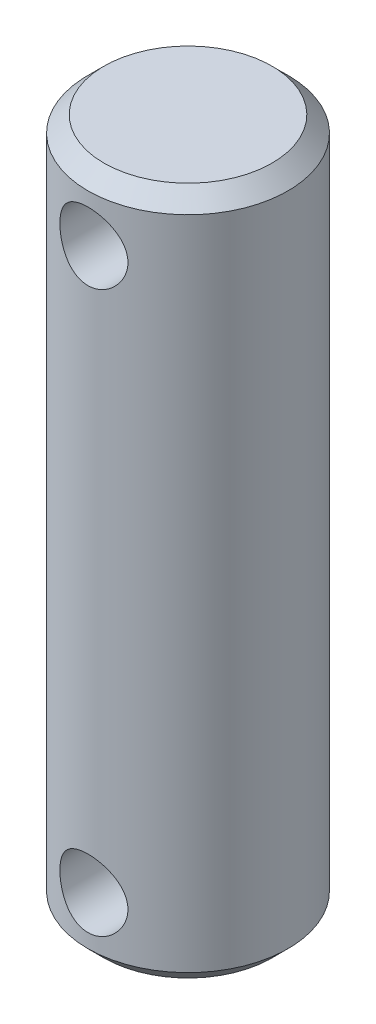
ISO-10303-21;
HEADER;
FILE_DESCRIPTION(('STEP AP214'),'2;1');
FILE_NAME('part.step','',(''),(''),'','','');
FILE_SCHEMA(('AUTOMOTIVE_DESIGN { 1 0 10303 214 1 1 1 1 }'));
ENDSEC;
DATA;
#1=APPLICATION_CONTEXT('core data for automotive mechanical design processes');
#2=APPLICATION_PROTOCOL_DEFINITION('international standard','automotive_design',2000,#1);
#3=PRODUCT_CONTEXT('',#1,'mechanical');
#4=PRODUCT('Part','Part','',(#3));
#5=PRODUCT_RELATED_PRODUCT_CATEGORY('part','',(#4));
#6=PRODUCT_DEFINITION_FORMATION('','',#4);
#7=PRODUCT_DEFINITION_CONTEXT('part definition',#1,'design');
#8=PRODUCT_DEFINITION('design','',#6,#7);
#9=PRODUCT_DEFINITION_SHAPE('','',#8);
#10=(LENGTH_UNIT() NAMED_UNIT(*) SI_UNIT(.MILLI.,.METRE.));
#11=(NAMED_UNIT(*) PLANE_ANGLE_UNIT() SI_UNIT($,.RADIAN.));
#12=(NAMED_UNIT(*) SI_UNIT($,.STERADIAN.) SOLID_ANGLE_UNIT());
#13=UNCERTAINTY_MEASURE_WITH_UNIT(LENGTH_MEASURE(1.E-05),#10,'distance_accuracy_value','');
#14=(GEOMETRIC_REPRESENTATION_CONTEXT(3) GLOBAL_UNCERTAINTY_ASSIGNED_CONTEXT((#13)) GLOBAL_UNIT_ASSIGNED_CONTEXT((#10,
#11,#12)) REPRESENTATION_CONTEXT('',''));
#15=CARTESIAN_POINT('',(0.,0.,0.));
#16=DIRECTION('',(0.,0.,1.));
#17=DIRECTION('',(1.,0.,0.));
#18=AXIS2_PLACEMENT_3D('',#15,#16,#17);
#19=CARTESIAN_POINT('',(0.,43.,0.));
#20=DIRECTION('',(0.,-1.,0.));
#21=DIRECTION('',(0.,0.,-1.));
#22=AXIS2_PLACEMENT_3D('',#19,#20,#21);
#23=CYLINDRICAL_SURFACE('',#22,12.5);
#24=CARTESIAN_POINT('',(0.,39.25,-12.5));
#25=CARTESIAN_POINT('',(-0.231629316585797,39.2500020330341,-12.5000013493631));
#26=CARTESIAN_POINT('',(-0.463244602260156,39.2310026670462,-12.493502868787));
#27=CARTESIAN_POINT('',(-0.919637198733393,39.1557510509299,-12.4682205879803));
#28=CARTESIAN_POINT('',(-1.14441406994913,39.0994964112488,-12.4494359997198));
#29=CARTESIAN_POINT('',(-1.58048439723264,38.9518965380055,-12.4016188733298));
#30=CARTESIAN_POINT('',(-1.79180021823001,38.860611378287,-12.3726038861914));
#31=CARTESIAN_POINT('',(-2.1961203899874,38.6458184811844,-12.3072763657775));
#32=CARTESIAN_POINT('',(-2.38912089291743,38.5223039931499,-12.270962304028));
#33=CARTESIAN_POINT('',(-2.75825261944734,38.2419106918981,-12.1933910285169));
#34=CARTESIAN_POINT('',(-2.93363688121842,38.0840824421219,-12.1520119725704));
#35=CARTESIAN_POINT('',(-3.25602333800846,37.7415597009182,-12.069633438027));
#36=CARTESIAN_POINT('',(-3.40301894005994,37.5568589860642,-12.0286340497037));
#37=CARTESIAN_POINT('',(-3.66879190776174,37.1590227206061,-11.9503048632061));
#38=CARTESIAN_POINT('',(-3.78658554363524,36.9451980705236,-11.9131228611846));
#39=CARTESIAN_POINT('',(-3.98421855180598,36.499305339374,-11.8484975327096));
#40=CARTESIAN_POINT('',(-4.06407004270031,36.2672431109649,-11.8210510974587));
#41=CARTESIAN_POINT('',(-4.180727158555,35.7999754672721,-11.7802904138908));
#42=CARTESIAN_POINT('',(-4.21893677153849,35.5651618601511,-11.7665167255043));
#43=CARTESIAN_POINT('',(-4.2556150496915,35.0920834933359,-11.7533040945085));
#44=CARTESIAN_POINT('',(-4.25409658909983,34.8538198766629,-11.7538605081001));
#45=CARTESIAN_POINT('',(-4.21244934024964,34.3927050541706,-11.7688435667819));
#46=CARTESIAN_POINT('',(-4.1741694203804,34.1696614961546,-11.7826060062583));
#47=CARTESIAN_POINT('',(-4.06310816523945,33.733374512476,-11.8213609901718));
#48=CARTESIAN_POINT('',(-3.99032254229152,33.5201323083421,-11.8463549302143));
#49=CARTESIAN_POINT('',(-3.81113653039608,33.1053676287839,-11.9052184288415));
#50=CARTESIAN_POINT('',(-3.70419900732797,32.9040979714414,-11.9392282253861));
#51=CARTESIAN_POINT('',(-3.46011773998614,32.5217829261275,-12.0122344758095));
#52=CARTESIAN_POINT('',(-3.3229649914025,32.3407435911989,-12.0512324147271));
#53=CARTESIAN_POINT('',(-3.01353124215082,31.993661489716,-12.1324166416207));
#54=CARTESIAN_POINT('',(-2.83974395035441,31.8289723564576,-12.1746609041245));
#55=CARTESIAN_POINT('',(-2.4665017699171,31.530714672255,-12.2557250188891));
#56=CARTESIAN_POINT('',(-2.26704421977735,31.397149352277,-12.294544515365));
#57=CARTESIAN_POINT('',(-1.84516436753422,31.1637817200249,-12.3649312356261));
#58=CARTESIAN_POINT('',(-1.62251944687187,31.0643554382244,-12.3964165316577));
#59=CARTESIAN_POINT('',(-1.16233553494295,30.9047926289126,-12.4479909440337));
#60=CARTESIAN_POINT('',(-0.924801969927407,30.8446418774178,-12.4680841857644));
#61=CARTESIAN_POINT('',(-0.453032806948612,30.7677666520223,-12.4939206883818));
#62=CARTESIAN_POINT('',(-0.219127772365227,30.7492140835185,-12.5002675966187));
#63=CARTESIAN_POINT('',(0.248508234272228,30.7508366933351,-12.499715139365));
#64=CARTESIAN_POINT('',(0.482239229767976,30.7710050341146,-12.4928181125577));
#65=CARTESIAN_POINT('',(0.935487055917019,30.8480582339634,-12.4669514589193));
#66=CARTESIAN_POINT('',(1.15521999196989,30.9038095457653,-12.4483547937561));
#67=CARTESIAN_POINT('',(1.58211571473706,31.049017457826,-12.4013331971436));
#68=CARTESIAN_POINT('',(1.78927688332144,31.138478386259,-12.3729070036624));
#69=CARTESIAN_POINT('',(2.19135854363443,31.3512234537794,-12.3081499547371));
#70=CARTESIAN_POINT('',(2.3858005114391,31.475351890635,-12.2716272117682));
#71=CARTESIAN_POINT('',(2.75168306551547,31.7529228847875,-12.1948041286534));
#72=CARTESIAN_POINT('',(2.9231163500378,31.9063747105205,-12.1545025961777));
#73=CARTESIAN_POINT('',(3.24657351287904,32.2468275664985,-12.0722386132383));
#74=CARTESIAN_POINT('',(3.39729328842665,32.435073487899,-12.0302879182072));
#75=CARTESIAN_POINT('',(3.66518020873975,32.8350778779993,-11.9514023496921));
#76=CARTESIAN_POINT('',(3.78234674334563,33.0468367741812,-11.914467567428));
#77=CARTESIAN_POINT('',(3.97933669538634,33.4881566802981,-11.8501336294714));
#78=CARTESIAN_POINT('',(4.05920753889126,33.717694646285,-11.8227223748613));
#79=CARTESIAN_POINT('',(4.17877629044749,34.1881175672848,-11.7809981443993));
#80=CARTESIAN_POINT('',(4.21849327320324,34.4289970776366,-11.7666789496003));
#81=CARTESIAN_POINT('',(4.2551029021973,34.9014252701727,-11.7534862510052));
#82=CARTESIAN_POINT('',(4.2541688433069,35.132785450644,-11.7538288765012));
#83=CARTESIAN_POINT('',(4.21488538095235,35.5918665676405,-11.7679720866019));
#84=CARTESIAN_POINT('',(4.17653837981658,35.8195877368765,-11.781771807111));
#85=CARTESIAN_POINT('',(4.06508169516974,36.2602486699102,-11.8206793925214));
#86=CARTESIAN_POINT('',(3.99270334550051,36.4733961386628,-11.8455487968498));
#87=CARTESIAN_POINT('',(3.81583792726955,36.8846811689962,-11.9036971533386));
#88=CARTESIAN_POINT('',(3.71134355482287,37.0828153034268,-11.9369780181425));
#89=CARTESIAN_POINT('',(3.46772073523882,37.4681337048613,-12.0100690469571));
#90=CARTESIAN_POINT('',(3.32724348872325,37.6544218744554,-12.0501058971147));
#91=CARTESIAN_POINT('',(3.01789256015419,38.0014819910172,-12.1312763731794));
#92=CARTESIAN_POINT('',(2.84901069833453,38.1622465618761,-12.1724103121393));
#93=CARTESIAN_POINT('',(2.4793015879225,38.4603796450803,-12.2531734329683));
#94=CARTESIAN_POINT('',(2.2774454476222,38.5965125530158,-12.2926709568964));
#95=CARTESIAN_POINT('',(1.85239769842136,38.8327805226005,-12.3638575017702));
#96=CARTESIAN_POINT('',(1.62921053671336,38.9329230670564,-12.3955481454238));
#97=CARTESIAN_POINT('',(1.1749855410373,39.0911995465962,-12.4466848305204));
#98=CARTESIAN_POINT('',(0.944413374480446,39.1505523489214,-12.4664836857426));
#99=CARTESIAN_POINT('',(0.475887689244039,39.2299455427374,-12.4931386057906));
#100=CARTESIAN_POINT('',(0.237936441911583,39.2499979116076,-12.4999986138946));
#101=CARTESIAN_POINT('',(0.,39.25,-12.5));
#102=B_SPLINE_CURVE_WITH_KNOTS('',3,(#24,#25,#26,#27,#28,#29,#30,#31,#32,#33,#34,#35,#36,#37,
#38,#39,#40,#41,#42,#43,#44,#45,#46,#47,#48,#49,#50,#51,#52,#53,#54,#55,#56,#57,#58,#59,#60,#61,
#62,#63,#64,#65,#66,#67,#68,#69,#70,#71,#72,#73,#74,#75,#76,#77,#78,#79,#80,#81,#82,#83,#84,#85,
#86,#87,#88,#89,#90,#91,#92,#93,#94,#95,#96,#97,#98,#99,#100,#101),.UNSPECIFIED.,.T.,.F.,(4,2,2,
2,2,2,2,2,2,2,2,2,2,2,2,2,2,2,2,2,2,2,2,2,2,2,2,2,2,2,2,2,2,2,2,2,2,2,4),(0.,0.694012031135522,
1.38806858050572,2.08094017307814,2.77395700894337,3.48937549744916,4.20495993509719,
4.94210626785764,5.67901699996315,6.39023024980915,7.10121302747361,7.77821403353031,
8.45529918574264,9.14360628251112,9.83211877686468,10.5581272082641,11.2842109731308,
12.0180534127162,12.7516299370932,13.4522781499046,14.1528026499667,14.8320547208526,
15.5113940346079,16.2089885679879,16.9068039604598,17.6376748123878,18.368558954226,
19.0985111385898,19.8281164030437,20.5187658396099,21.2093709316938,21.8857695188882,
22.5623220478608,23.2693695244284,23.976620961389,24.7129879656022,25.4492017820333,
26.1623287080454,26.8752382644273),.UNSPECIFIED.);
#103=CARTESIAN_POINT('',(0.,39.25,-12.5));
#104=VERTEX_POINT('',#103);
#105=EDGE_CURVE('E50',#104,#104,#102,.T.);
#106=ORIENTED_EDGE('',*,*,#105,.T.);
#107=EDGE_LOOP('',(#106));
#108=FACE_BOUND('',#107,.T.);
#109=CARTESIAN_POINT('',(4.25,35.,11.7553179455087));
#110=CARTESIAN_POINT('',(4.25000208635938,34.7688082243958,11.7553163048564));
#111=CARTESIAN_POINT('',(4.23107177309128,34.5376306111017,11.7622127031611));
#112=CARTESIAN_POINT('',(4.15611937649357,34.0821430943685,11.7889024426549));
#113=CARTESIAN_POINT('',(4.10009241001671,33.8578340991343,11.8086974817267));
#114=CARTESIAN_POINT('',(3.95315727615972,33.4227597886088,11.8586887228588));
#115=CARTESIAN_POINT('',(3.86231972243053,33.2119680573483,11.8888638561852));
#116=CARTESIAN_POINT('',(3.64858465717113,32.8085451145788,11.9561841704273));
#117=CARTESIAN_POINT('',(3.52567963418154,32.6159181723876,11.9933309838111));
#118=CARTESIAN_POINT('',(3.24593667986677,32.2464478386544,12.0721055733369));
#119=CARTESIAN_POINT('',(3.08801191357713,32.0704516300864,12.1138482614208));
#120=CARTESIAN_POINT('',(2.74502977872382,31.7468608782459,12.1961419607755));
#121=CARTESIAN_POINT('',(2.55996786105974,31.5992711064602,12.2366927708767));
#122=CARTESIAN_POINT('',(2.16173358215593,31.332803063851,12.3133695834904));
#123=CARTESIAN_POINT('',(1.9479322684075,31.2148175164114,12.3493447648353));
#124=CARTESIAN_POINT('',(1.50208314069309,31.0168239888865,12.4114588114545));
#125=CARTESIAN_POINT('',(1.27004047751297,30.9368053327207,12.4376004414402));
#126=CARTESIAN_POINT('',(0.803181808925197,30.819904815012,12.4762877361144));
#127=CARTESIAN_POINT('',(0.56876802409283,30.781570565411,12.4892899687544));
#128=CARTESIAN_POINT('',(0.0964986813327523,30.7445035304582,12.5018568685094));
#129=CARTESIAN_POINT('',(-0.141355937364765,30.7457601346843,12.5014251359524));
#130=CARTESIAN_POINT('',(-0.603455244429959,30.7869293778599,12.4874792686763));
#131=CARTESIAN_POINT('',(-0.827859366125014,30.8252633639397,12.474499409838));
#132=CARTESIAN_POINT('',(-1.26683563867679,30.9368817672938,12.4375910854643));
#133=CARTESIAN_POINT('',(-1.48140711554011,31.0101685765457,12.4136618706201));
#134=CARTESIAN_POINT('',(-1.8980164033555,31.1905041300386,12.3568751775078));
#135=CARTESIAN_POINT('',(-2.09984758406958,31.2979923868106,12.3239022889639));
#136=CARTESIAN_POINT('',(-2.48306659203639,31.5433137607319,12.2524460502634));
#137=CARTESIAN_POINT('',(-2.66444855405648,31.681155550554,12.2139611262977));
#138=CARTESIAN_POINT('',(-3.01099992399037,31.9911745301492,12.1333048225972));
#139=CARTESIAN_POINT('',(-3.17494418986543,32.1647002678062,12.0910451976412));
#140=CARTESIAN_POINT('',(-3.4718123267595,32.5371276123441,12.0091752957356));
#141=CARTESIAN_POINT('',(-3.60473100646118,32.7360334573203,11.969565462949));
#142=CARTESIAN_POINT('',(-3.83756473071074,33.1575999287105,11.8969851778806));
#143=CARTESIAN_POINT('',(-3.93694148373781,33.3805784989992,11.8641260508176));
#144=CARTESIAN_POINT('',(-4.09631339640205,33.841505720852,11.8100543141711));
#145=CARTESIAN_POINT('',(-4.15632586418345,34.0794477426114,11.7888365866345));
#146=CARTESIAN_POINT('',(-4.23272709729825,34.551640096284,11.7616154920121));
#147=CARTESIAN_POINT('',(-4.25102291540232,34.7855435602831,11.7549476419358));
#148=CARTESIAN_POINT('',(-4.24888913268011,35.253124045222,11.7557200468072));
#149=CARTESIAN_POINT('',(-4.22846693505826,35.4868011009053,11.7631576046845));
#150=CARTESIAN_POINT('',(-4.15119312232908,35.9384588804628,11.790638359865));
#151=CARTESIAN_POINT('',(-4.09568855042672,36.1567015418879,11.8102149538794));
#152=CARTESIAN_POINT('',(-3.9514537893724,36.5807242875293,11.8592485003546));
#153=CARTESIAN_POINT('',(-3.86271756175014,36.7865020988783,11.888707248384));
#154=CARTESIAN_POINT('',(-3.65124748009679,37.1872093806727,11.9553766913527));
#155=CARTESIAN_POINT('',(-3.52749746510955,37.3815646574045,11.9928092351957));
#156=CARTESIAN_POINT('',(-3.25065304738288,37.7474387202912,12.0707872460142));
#157=CARTESIAN_POINT('',(-3.09754966045709,37.9189504874256,12.1113336637695));
#158=CARTESIAN_POINT('',(-2.75718975144257,38.2432047947156,12.1934414759765));
#159=CARTESIAN_POINT('',(-2.56860120561712,38.3945664440502,12.2349510943746));
#160=CARTESIAN_POINT('',(-2.16767839127811,38.6635958933644,12.3123024299383));
#161=CARTESIAN_POINT('',(-1.9553448608948,38.7812647403048,12.3481443232058));
#162=CARTESIAN_POINT('',(-1.51390748124952,38.9785220351902,12.4099713333259));
#163=CARTESIAN_POINT('',(-1.28491760269165,39.0583455126643,12.4360170721838));
#164=CARTESIAN_POINT('',(-0.815699002397316,39.1780013666957,12.4755748071516));
#165=CARTESIAN_POINT('',(-0.575474556193982,39.2178488293486,12.489091531298));
#166=CARTESIAN_POINT('',(-0.103211830111088,39.2550209742181,12.50169717107));
#167=CARTESIAN_POINT('',(0.128654421017075,39.2543244388139,12.501457487594));
#168=CARTESIAN_POINT('',(0.588812496753036,39.2153415064129,12.4882452162174));
#169=CARTESIAN_POINT('',(0.817104629585829,39.177058369155,12.4752737324961));
#170=CARTESIAN_POINT('',(1.25973733436524,39.0653164091026,12.438311718123));
#171=CARTESIAN_POINT('',(1.47424962273104,38.992469689247,12.4145132190251));
#172=CARTESIAN_POINT('',(1.88808156366101,38.8142408217572,12.3583495347409));
#173=CARTESIAN_POINT('',(2.08739842506849,38.7088527146591,12.3259827805629));
#174=CARTESIAN_POINT('',(2.47341490547125,38.4639468867196,12.2544776933187));
#175=CARTESIAN_POINT('',(2.65935109194141,38.3232880355071,12.2151293747917));
#176=CARTESIAN_POINT('',(3.0056225058322,38.0137518219909,12.1345744052391));
#177=CARTESIAN_POINT('',(3.16594936631593,37.8448652740194,12.0933671524889));
#178=CARTESIAN_POINT('',(3.46317770167238,37.4753569274188,12.0117094140378));
#179=CARTESIAN_POINT('',(3.59884229876753,37.2737145025818,11.9713600094017));
#180=CARTESIAN_POINT('',(3.83428262236864,36.8492278836957,11.8980483180312));
#181=CARTESIAN_POINT('',(3.93406590564969,36.6263881664128,11.865084476414));
#182=CARTESIAN_POINT('',(4.09175788445509,36.1729356054837,11.8116162303556));
#183=CARTESIAN_POINT('',(4.15089676108841,35.9427949668864,11.7907491035731));
#184=CARTESIAN_POINT('',(4.23000923378121,35.4750959809143,11.7626034107323));
#185=CARTESIAN_POINT('',(4.24999785634726,35.2375405150521,11.7553196312149));
#186=CARTESIAN_POINT('',(4.25,35.,11.7553179455087));
#187=B_SPLINE_CURVE_WITH_KNOTS('',3,(#109,#110,#111,#112,#113,#114,#115,#116,#117,#118,#119,
#120,#121,#122,#123,#124,#125,#126,#127,#128,#129,#130,#131,#132,#133,#134,#135,#136,#137,#138,
#139,#140,#141,#142,#143,#144,#145,#146,#147,#148,#149,#150,#151,#152,#153,#154,#155,#156,#157,
#158,#159,#160,#161,#162,#163,#164,#165,#166,#167,#168,#169,#170,#171,#172,#173,#174,#175,#176,
#177,#178,#179,#180,#181,#182,#183,#184,#185,#186),.UNSPECIFIED.,.T.,.F.,(4,2,2,2,2,2,2,2,2,2,2,
2,2,2,2,2,2,2,2,2,2,2,2,2,2,2,2,2,2,2,2,2,2,2,2,2,2,2,4),(0.,0.692694920384615,1.38548104047712,
2.07686921235575,2.76841948009047,3.48554525708903,4.20279138623515,4.93959691860359,
5.67619514235265,6.38621339082408,7.09604135470939,7.77691942027095,8.45784408804076,
9.14789875658826,9.83815084536889,10.5621283168264,11.2862268402086,12.0214474433795,
12.7563445591683,13.456908323454,14.1573381476704,14.8323840278356,15.5075526290563,
16.2047830406201,16.9022271951569,17.6348081128836,18.3673662641226,19.0953134364972,
19.8229857936747,20.515174766614,21.2073037140138,21.8876085563469,22.5680380602091,
23.2742297793021,23.9806517515895,24.7161707244757,25.4515347027242,26.1635249917672,
26.8752419537226),.UNSPECIFIED.);
#188=CARTESIAN_POINT('',(4.25,35.,11.7553179455087));
#189=VERTEX_POINT('',#188);
#190=EDGE_CURVE('E113',#189,#189,#187,.T.);
#191=ORIENTED_EDGE('',*,*,#190,.T.);
#192=EDGE_LOOP('',(#191));
#193=FACE_BOUND('',#192,.T.);
#194=CARTESIAN_POINT('',(0.,-30.75,-12.5));
#195=CARTESIAN_POINT('',(-0.231629316585798,-30.7499979669659,-12.5000013493631));
#196=CARTESIAN_POINT('',(-0.463244602260157,-30.7689973329538,-12.493502868787));
#197=CARTESIAN_POINT('',(-0.919637198733394,-30.8442489490701,-12.4682205879803));
#198=CARTESIAN_POINT('',(-1.14441406994913,-30.9005035887512,-12.4494359997198));
#199=CARTESIAN_POINT('',(-1.58048439723264,-31.0481034619945,-12.4016188733298));
#200=CARTESIAN_POINT('',(-1.79180021823001,-31.139388621713,-12.3726038861914));
#201=CARTESIAN_POINT('',(-2.1961203899874,-31.3541815188156,-12.3072763657775));
#202=CARTESIAN_POINT('',(-2.38912089291743,-31.4776960068501,-12.270962304028));
#203=CARTESIAN_POINT('',(-2.75825261944734,-31.7580893081019,-12.1933910285169));
#204=CARTESIAN_POINT('',(-2.93363688121843,-31.9159175578781,-12.1520119725704));
#205=CARTESIAN_POINT('',(-3.25602333800847,-32.2584402990818,-12.069633438027));
#206=CARTESIAN_POINT('',(-3.40301894005995,-32.4431410139358,-12.0286340497037));
#207=CARTESIAN_POINT('',(-3.66879190776175,-32.8409772793939,-11.9503048632061));
#208=CARTESIAN_POINT('',(-3.78658554363525,-33.0548019294764,-11.9131228611846));
#209=CARTESIAN_POINT('',(-3.98421855180598,-33.500694660626,-11.8484975327096));
#210=CARTESIAN_POINT('',(-4.06407004270031,-33.7327568890351,-11.8210510974587));
#211=CARTESIAN_POINT('',(-4.180727158555,-34.2000245327279,-11.7802904138908));
#212=CARTESIAN_POINT('',(-4.21893677153849,-34.4348381398489,-11.7665167255043));
#213=CARTESIAN_POINT('',(-4.2556150496915,-34.9079165066641,-11.7533040945085));
#214=CARTESIAN_POINT('',(-4.25409658909983,-35.1461801233371,-11.7538605081001));
#215=CARTESIAN_POINT('',(-4.21244934024964,-35.6072949458294,-11.7688435667819));
#216=CARTESIAN_POINT('',(-4.1741694203804,-35.8303385038454,-11.7826060062583));
#217=CARTESIAN_POINT('',(-4.06310816523945,-36.266625487524,-11.8213609901718));
#218=CARTESIAN_POINT('',(-3.99032254229152,-36.4798676916579,-11.8463549302143));
#219=CARTESIAN_POINT('',(-3.81113653039608,-36.8946323712161,-11.9052184288415));
#220=CARTESIAN_POINT('',(-3.70419900732797,-37.0959020285586,-11.9392282253861));
#221=CARTESIAN_POINT('',(-3.46011773998614,-37.4782170738726,-12.0122344758095));
#222=CARTESIAN_POINT('',(-3.3229649914025,-37.6592564088011,-12.0512324147271));
#223=CARTESIAN_POINT('',(-3.01353124215082,-38.006338510284,-12.1324166416207));
#224=CARTESIAN_POINT('',(-2.83974395035441,-38.1710276435424,-12.1746609041245));
#225=CARTESIAN_POINT('',(-2.46650176991709,-38.469285327745,-12.2557250188891));
#226=CARTESIAN_POINT('',(-2.26704421977735,-38.602850647723,-12.294544515365));
#227=CARTESIAN_POINT('',(-1.84516436753422,-38.8362182799751,-12.3649312356261));
#228=CARTESIAN_POINT('',(-1.62251944687187,-38.9356445617756,-12.3964165316577));
#229=CARTESIAN_POINT('',(-1.16233553494295,-39.0952073710874,-12.4479909440337));
#230=CARTESIAN_POINT('',(-0.924801969927407,-39.1553581225822,-12.4680841857644));
#231=CARTESIAN_POINT('',(-0.453032806948612,-39.2322333479777,-12.4939206883818));
#232=CARTESIAN_POINT('',(-0.219127772365226,-39.2507859164815,-12.5002675966187));
#233=CARTESIAN_POINT('',(0.248508234272229,-39.2491633066649,-12.499715139365));
#234=CARTESIAN_POINT('',(0.482239229767977,-39.2289949658854,-12.4928181125577));
#235=CARTESIAN_POINT('',(0.93548705591702,-39.1519417660366,-12.4669514589193));
#236=CARTESIAN_POINT('',(1.15521999196989,-39.0961904542347,-12.4483547937561));
#237=CARTESIAN_POINT('',(1.58211571473706,-38.9509825421741,-12.4013331971436));
#238=CARTESIAN_POINT('',(1.78927688332144,-38.861521613741,-12.3729070036624));
#239=CARTESIAN_POINT('',(2.19135854363443,-38.6487765462206,-12.3081499547371));
#240=CARTESIAN_POINT('',(2.3858005114391,-38.524648109365,-12.2716272117682));
#241=CARTESIAN_POINT('',(2.75168306551547,-38.2470771152126,-12.1948041286534));
#242=CARTESIAN_POINT('',(2.92311635003781,-38.0936252894795,-12.1545025961777));
#243=CARTESIAN_POINT('',(3.24657351287904,-37.7531724335015,-12.0722386132383));
#244=CARTESIAN_POINT('',(3.39729328842665,-37.564926512101,-12.0302879182072));
#245=CARTESIAN_POINT('',(3.66518020873975,-37.1649221220007,-11.9514023496921));
#246=CARTESIAN_POINT('',(3.78234674334563,-36.9531632258188,-11.914467567428));
#247=CARTESIAN_POINT('',(3.97933669538634,-36.5118433197019,-11.8501336294714));
#248=CARTESIAN_POINT('',(4.05920753889126,-36.282305353715,-11.8227223748612));
#249=CARTESIAN_POINT('',(4.17877629044749,-35.8118824327152,-11.7809981443993));
#250=CARTESIAN_POINT('',(4.21849327320324,-35.5710029223634,-11.7666789496003));
#251=CARTESIAN_POINT('',(4.2551029021973,-35.0985747298273,-11.7534862510052));
#252=CARTESIAN_POINT('',(4.2541688433069,-34.867214549356,-11.7538288765012));
#253=CARTESIAN_POINT('',(4.21488538095235,-34.4081334323595,-11.7679720866019));
#254=CARTESIAN_POINT('',(4.17653837981658,-34.1804122631235,-11.781771807111));
#255=CARTESIAN_POINT('',(4.06508169516974,-33.7397513300898,-11.8206793925214));
#256=CARTESIAN_POINT('',(3.99270334550051,-33.5266038613372,-11.8455487968498));
#257=CARTESIAN_POINT('',(3.81583792726954,-33.1153188310038,-11.9036971533386));
#258=CARTESIAN_POINT('',(3.71134355482286,-32.9171846965732,-11.9369780181425));
#259=CARTESIAN_POINT('',(3.46772073523882,-32.5318662951387,-12.0100690469571));
#260=CARTESIAN_POINT('',(3.32724348872325,-32.3455781255446,-12.0501058971147));
#261=CARTESIAN_POINT('',(3.0178925601542,-31.9985180089828,-12.1312763731794));
#262=CARTESIAN_POINT('',(2.84901069833453,-31.837753438124,-12.1724103121393));
#263=CARTESIAN_POINT('',(2.4793015879225,-31.5396203549197,-12.2531734329683));
#264=CARTESIAN_POINT('',(2.2774454476222,-31.4034874469842,-12.2926709568964));
#265=CARTESIAN_POINT('',(1.85239769842135,-31.1672194773995,-12.3638575017702));
#266=CARTESIAN_POINT('',(1.62921053671336,-31.0670769329437,-12.3955481454238));
#267=CARTESIAN_POINT('',(1.1749855410373,-30.9088004534038,-12.4466848305204));
#268=CARTESIAN_POINT('',(0.944413374480445,-30.8494476510786,-12.4664836857426));
#269=CARTESIAN_POINT('',(0.475887689244039,-30.7700544572626,-12.4931386057906));
#270=CARTESIAN_POINT('',(0.237936441911583,-30.7500020883924,-12.4999986138946));
#271=CARTESIAN_POINT('',(0.,-30.75,-12.5));
#272=B_SPLINE_CURVE_WITH_KNOTS('',3,(#194,#195,#196,#197,#198,#199,#200,#201,#202,#203,#204,
#205,#206,#207,#208,#209,#210,#211,#212,#213,#214,#215,#216,#217,#218,#219,#220,#221,#222,#223,
#224,#225,#226,#227,#228,#229,#230,#231,#232,#233,#234,#235,#236,#237,#238,#239,#240,#241,#242,
#243,#244,#245,#246,#247,#248,#249,#250,#251,#252,#253,#254,#255,#256,#257,#258,#259,#260,#261,
#262,#263,#264,#265,#266,#267,#268,#269,#270,#271),.UNSPECIFIED.,.T.,.F.,(4,2,2,2,2,2,2,2,2,2,2,
2,2,2,2,2,2,2,2,2,2,2,2,2,2,2,2,2,2,2,2,2,2,2,2,2,2,2,4),(0.,0.694012031135522,1.38806858050573,
2.08094017307814,2.77395700894338,3.48937549744917,4.20495993509719,4.94210626785764,
5.67901699996315,6.39023024980915,7.10121302747361,7.77821403353031,8.45529918574264,
9.14360628251112,9.83211877686468,10.5581272082641,11.2842109731308,12.0180534127162,
12.7516299370932,13.4522781499046,14.1528026499667,14.8320547208526,15.5113940346079,
16.2089885679879,16.9068039604599,17.6376748123878,18.368558954226,19.0985111385898,
19.8281164030437,20.5187658396099,21.2093709316938,21.8857695188883,22.5623220478608,
23.2693695244284,23.976620961389,24.7129879656022,25.4492017820333,26.1623287080454,
26.8752382644273),.UNSPECIFIED.);
#273=CARTESIAN_POINT('',(0.,-30.75,-12.5));
#274=VERTEX_POINT('',#273);
#275=EDGE_CURVE('E78',#274,#274,#272,.T.);
#276=ORIENTED_EDGE('',*,*,#275,.T.);
#277=EDGE_LOOP('',(#276));
#278=FACE_BOUND('',#277,.T.);
#279=CARTESIAN_POINT('',(4.25,-35.,11.7553179455087));
#280=CARTESIAN_POINT('',(4.25000208635938,-35.2311917756042,11.7553163048564));
#281=CARTESIAN_POINT('',(4.23107177309128,-35.4623693888983,11.7622127031611));
#282=CARTESIAN_POINT('',(4.15611937649357,-35.9178569056315,11.7889024426549));
#283=CARTESIAN_POINT('',(4.10009241001671,-36.1421659008657,11.8086974817267));
#284=CARTESIAN_POINT('',(3.95315727615972,-36.5772402113912,11.8586887228588));
#285=CARTESIAN_POINT('',(3.86231972243054,-36.7880319426517,11.8888638561852));
#286=CARTESIAN_POINT('',(3.64858465717114,-37.1914548854212,11.9561841704273));
#287=CARTESIAN_POINT('',(3.52567963418154,-37.3840818276124,11.9933309838111));
#288=CARTESIAN_POINT('',(3.24593667986677,-37.7535521613456,12.0721055733369));
#289=CARTESIAN_POINT('',(3.08801191357713,-37.9295483699136,12.1138482614208));
#290=CARTESIAN_POINT('',(2.74502977872382,-38.2531391217541,12.1961419607755));
#291=CARTESIAN_POINT('',(2.55996786105974,-38.4007288935398,12.2366927708767));
#292=CARTESIAN_POINT('',(2.16173358215593,-38.667196936149,12.3133695834904));
#293=CARTESIAN_POINT('',(1.94793226840749,-38.7851824835886,12.3493447648353));
#294=CARTESIAN_POINT('',(1.50208314069309,-38.9831760111135,12.4114588114545));
#295=CARTESIAN_POINT('',(1.27004047751297,-39.0631946672793,12.4376004414402));
#296=CARTESIAN_POINT('',(0.803181808925197,-39.180095184988,12.4762877361144));
#297=CARTESIAN_POINT('',(0.568768024092831,-39.218429434589,12.4892899687544));
#298=CARTESIAN_POINT('',(0.0964986813327525,-39.2554964695418,12.5018568685094));
#299=CARTESIAN_POINT('',(-0.141355937364764,-39.2542398653157,12.5014251359524));
#300=CARTESIAN_POINT('',(-0.603455244429959,-39.2130706221401,12.4874792686763));
#301=CARTESIAN_POINT('',(-0.827859366125015,-39.1747366360604,12.474499409838));
#302=CARTESIAN_POINT('',(-1.26683563867679,-39.0631182327062,12.4375910854643));
#303=CARTESIAN_POINT('',(-1.48140711554011,-38.9898314234543,12.4136618706201));
#304=CARTESIAN_POINT('',(-1.8980164033555,-38.8094958699615,12.3568751775078));
#305=CARTESIAN_POINT('',(-2.09984758406958,-38.7020076131894,12.3239022889639));
#306=CARTESIAN_POINT('',(-2.48306659203639,-38.4566862392681,12.2524460502634));
#307=CARTESIAN_POINT('',(-2.66444855405648,-38.318844449446,12.2139611262977));
#308=CARTESIAN_POINT('',(-3.01099992399037,-38.0088254698508,12.1333048225972));
#309=CARTESIAN_POINT('',(-3.17494418986543,-37.8352997321938,12.0910451976412));
#310=CARTESIAN_POINT('',(-3.4718123267595,-37.462872387656,12.0091752957356));
#311=CARTESIAN_POINT('',(-3.60473100646118,-37.2639665426797,11.969565462949));
#312=CARTESIAN_POINT('',(-3.83756473071074,-36.8424000712895,11.8969851778806));
#313=CARTESIAN_POINT('',(-3.93694148373781,-36.6194215010008,11.8641260508176));
#314=CARTESIAN_POINT('',(-4.09631339640205,-36.158494279148,11.8100543141711));
#315=CARTESIAN_POINT('',(-4.15632586418345,-35.9205522573886,11.7888365866345));
#316=CARTESIAN_POINT('',(-4.23272709729825,-35.448359903716,11.7616154920121));
#317=CARTESIAN_POINT('',(-4.25102291540232,-35.2144564397169,11.7549476419358));
#318=CARTESIAN_POINT('',(-4.24888913268011,-34.746875954778,11.7557200468072));
#319=CARTESIAN_POINT('',(-4.22846693505826,-34.5131988990948,11.7631576046845));
#320=CARTESIAN_POINT('',(-4.15119312232908,-34.0615411195372,11.790638359865));
#321=CARTESIAN_POINT('',(-4.09568855042672,-33.8432984581121,11.8102149538794));
#322=CARTESIAN_POINT('',(-3.9514537893724,-33.4192757124707,11.8592485003546));
#323=CARTESIAN_POINT('',(-3.86271756175014,-33.2134979011217,11.888707248384));
#324=CARTESIAN_POINT('',(-3.65124748009679,-32.8127906193273,11.9553766913527));
#325=CARTESIAN_POINT('',(-3.52749746510955,-32.6184353425955,11.9928092351957));
#326=CARTESIAN_POINT('',(-3.25065304738288,-32.2525612797088,12.0707872460142));
#327=CARTESIAN_POINT('',(-3.09754966045709,-32.0810495125744,12.1113336637695));
#328=CARTESIAN_POINT('',(-2.75718975144257,-31.7567952052844,12.1934414759765));
#329=CARTESIAN_POINT('',(-2.56860120561712,-31.6054335559498,12.2349510943746));
#330=CARTESIAN_POINT('',(-2.16767839127811,-31.3364041066356,12.3123024299383));
#331=CARTESIAN_POINT('',(-1.9553448608948,-31.2187352596952,12.3481443232058));
#332=CARTESIAN_POINT('',(-1.51390748124952,-31.0214779648098,12.4099713333259));
#333=CARTESIAN_POINT('',(-1.28491760269165,-30.9416544873357,12.4360170721838));
#334=CARTESIAN_POINT('',(-0.81569900239732,-30.8219986333043,12.4755748071516));
#335=CARTESIAN_POINT('',(-0.575474556193985,-30.7821511706514,12.489091531298));
#336=CARTESIAN_POINT('',(-0.10321183011109,-30.7449790257819,12.50169717107));
#337=CARTESIAN_POINT('',(0.128654421017073,-30.7456755611861,12.501457487594));
#338=CARTESIAN_POINT('',(0.588812496753035,-30.7846584935871,12.4882452162174));
#339=CARTESIAN_POINT('',(0.817104629585828,-30.822941630845,12.4752737324961));
#340=CARTESIAN_POINT('',(1.25973733436524,-30.9346835908974,12.438311718123));
#341=CARTESIAN_POINT('',(1.47424962273104,-31.0075303107531,12.4145132190251));
#342=CARTESIAN_POINT('',(1.88808156366101,-31.1857591782429,12.3583495347409));
#343=CARTESIAN_POINT('',(2.08739842506849,-31.2911472853409,12.3259827805629));
#344=CARTESIAN_POINT('',(2.47341490547125,-31.5360531132804,12.2544776933187));
#345=CARTESIAN_POINT('',(2.65935109194141,-31.6767119644929,12.2151293747917));
#346=CARTESIAN_POINT('',(3.0056225058322,-31.9862481780091,12.1345744052391));
#347=CARTESIAN_POINT('',(3.16594936631593,-32.1551347259806,12.0933671524889));
#348=CARTESIAN_POINT('',(3.46317770167238,-32.5246430725812,12.0117094140378));
#349=CARTESIAN_POINT('',(3.59884229876753,-32.7262854974182,11.9713600094017));
#350=CARTESIAN_POINT('',(3.83428262236865,-33.1507721163043,11.8980483180312));
#351=CARTESIAN_POINT('',(3.9340659056497,-33.3736118335872,11.865084476414));
#352=CARTESIAN_POINT('',(4.0917578844551,-33.8270643945163,11.8116162303556));
#353=CARTESIAN_POINT('',(4.15089676108841,-34.0572050331136,11.7907491035731));
#354=CARTESIAN_POINT('',(4.23000923378121,-34.5249040190857,11.7626034107323));
#355=CARTESIAN_POINT('',(4.24999785634726,-34.7624594849479,11.7553196312149));
#356=CARTESIAN_POINT('',(4.25,-35.,11.7553179455087));
#357=B_SPLINE_CURVE_WITH_KNOTS('',3,(#279,#280,#281,#282,#283,#284,#285,#286,#287,#288,#289,
#290,#291,#292,#293,#294,#295,#296,#297,#298,#299,#300,#301,#302,#303,#304,#305,#306,#307,#308,
#309,#310,#311,#312,#313,#314,#315,#316,#317,#318,#319,#320,#321,#322,#323,#324,#325,#326,#327,
#328,#329,#330,#331,#332,#333,#334,#335,#336,#337,#338,#339,#340,#341,#342,#343,#344,#345,#346,
#347,#348,#349,#350,#351,#352,#353,#354,#355,#356),.UNSPECIFIED.,.T.,.F.,(4,2,2,2,2,2,2,2,2,2,2,
2,2,2,2,2,2,2,2,2,2,2,2,2,2,2,2,2,2,2,2,2,2,2,2,2,2,2,4),(0.,0.692694920384615,1.38548104047712,
2.07686921235573,2.76841948009047,3.48554525708903,4.20279138623515,4.9395969186036,
5.67619514235265,6.38621339082408,7.09604135470939,7.77691942027095,8.45784408804076,
9.14789875658826,9.83815084536889,10.5621283168264,11.2862268402086,12.0214474433795,
12.7563445591683,13.456908323454,14.1573381476704,14.8323840278356,15.5075526290563,
16.2047830406201,16.9022271951569,17.6348081128836,18.3673662641226,19.0953134364972,
19.8229857936747,20.515174766614,21.2073037140138,21.8876085563469,22.5680380602091,
23.2742297793021,23.9806517515895,24.7161707244757,25.4515347027242,26.1635249917672,
26.8752419537226),.UNSPECIFIED.);
#358=CARTESIAN_POINT('',(4.25,-35.,11.7553179455087));
#359=VERTEX_POINT('',#358);
#360=EDGE_CURVE('E70',#359,#359,#357,.T.);
#361=ORIENTED_EDGE('',*,*,#360,.T.);
#362=EDGE_LOOP('',(#361));
#363=FACE_BOUND('',#362,.T.);
#364=CARTESIAN_POINT('',(0.,-41.,0.));
#365=DIRECTION('',(0.,1.,0.));
#366=DIRECTION('',(0.,0.,1.));
#367=AXIS2_PLACEMENT_3D('',#364,#365,#366);
#368=CIRCLE('',#367,12.5);
#369=CARTESIAN_POINT('',(0.,-41.,12.5));
#370=VERTEX_POINT('',#369);
#371=EDGE_CURVE('E66',#370,#370,#368,.T.);
#372=ORIENTED_EDGE('',*,*,#371,.T.);
#373=EDGE_LOOP('',(#372));
#374=FACE_BOUND('',#373,.T.);
#375=CARTESIAN_POINT('',(0.,41.,0.));
#376=DIRECTION('',(0.,1.,0.));
#377=DIRECTION('',(0.,0.,1.));
#378=AXIS2_PLACEMENT_3D('',#375,#376,#377);
#379=CIRCLE('',#378,12.5);
#380=CARTESIAN_POINT('',(0.,41.,12.5));
#381=VERTEX_POINT('',#380);
#382=EDGE_CURVE('E124',#381,#381,#379,.F.);
#383=ORIENTED_EDGE('',*,*,#382,.T.);
#384=EDGE_LOOP('',(#383));
#385=FACE_BOUND('',#384,.T.);
#386=ADVANCED_FACE('F45',(#108,#193,#278,#363,#374,#385),#23,.T.);
#387=CARTESIAN_POINT('',(0.,43.,0.));
#388=DIRECTION('',(0.,1.,0.));
#389=DIRECTION('',(0.,0.,1.));
#390=AXIS2_PLACEMENT_3D('',#387,#388,#389);
#391=PLANE('',#390);
#392=CARTESIAN_POINT('',(0.,43.,0.));
#393=DIRECTION('',(0.,1.,0.));
#394=DIRECTION('',(0.,0.,1.));
#395=AXIS2_PLACEMENT_3D('',#392,#393,#394);
#396=CIRCLE('',#395,10.5);
#397=CARTESIAN_POINT('',(0.,43.,10.5));
#398=VERTEX_POINT('',#397);
#399=EDGE_CURVE('E10',#398,#398,#396,.T.);
#400=ORIENTED_EDGE('',*,*,#399,.T.);
#401=EDGE_LOOP('',(#400));
#402=FACE_BOUND('',#401,.T.);
#403=ADVANCED_FACE('F91',(#402),#391,.T.);
#404=CARTESIAN_POINT('',(0.,-43.,0.));
#405=DIRECTION('',(0.,1.,0.));
#406=DIRECTION('',(0.,0.,1.));
#407=AXIS2_PLACEMENT_3D('',#404,#405,#406);
#408=PLANE('',#407);
#409=CARTESIAN_POINT('',(0.,-43.,0.));
#410=DIRECTION('',(0.,1.,0.));
#411=DIRECTION('',(0.,0.,1.));
#412=AXIS2_PLACEMENT_3D('',#409,#410,#411);
#413=CIRCLE('',#412,10.5);
#414=CARTESIAN_POINT('',(0.,-43.,10.5));
#415=VERTEX_POINT('',#414);
#416=EDGE_CURVE('E60',#415,#415,#413,.F.);
#417=ORIENTED_EDGE('',*,*,#416,.T.);
#418=EDGE_LOOP('',(#417));
#419=FACE_BOUND('',#418,.T.);
#420=ADVANCED_FACE('F94',(#419),#408,.F.);
#421=CARTESIAN_POINT('',(0.,-41.,0.));
#422=DIRECTION('',(0.,1.,0.));
#423=DIRECTION('',(0.,0.,1.));
#424=AXIS2_PLACEMENT_3D('',#421,#422,#423);
#425=CONICAL_SURFACE('',#424,12.5,0.785398163397446);
#426=ORIENTED_EDGE('',*,*,#416,.F.);
#427=EDGE_LOOP('',(#426));
#428=FACE_BOUND('',#427,.T.);
#429=ORIENTED_EDGE('',*,*,#371,.F.);
#430=EDGE_LOOP('',(#429));
#431=FACE_BOUND('',#430,.T.);
#432=ADVANCED_FACE('F96',(#428,#431),#425,.T.);
#433=CARTESIAN_POINT('',(0.,43.,0.));
#434=DIRECTION('',(0.,-1.,0.));
#435=DIRECTION('',(0.,0.,-1.));
#436=AXIS2_PLACEMENT_3D('',#433,#434,#435);
#437=CONICAL_SURFACE('',#436,10.5,0.785398163397447);
#438=ORIENTED_EDGE('',*,*,#382,.F.);
#439=EDGE_LOOP('',(#438));
#440=FACE_BOUND('',#439,.T.);
#441=ORIENTED_EDGE('',*,*,#399,.F.);
#442=EDGE_LOOP('',(#441));
#443=FACE_BOUND('',#442,.T.);
#444=ADVANCED_FACE('F48',(#440,#443),#437,.T.);
#445=CARTESIAN_POINT('',(0.,-35.,-43.));
#446=DIRECTION('',(0.,0.,1.));
#447=DIRECTION('',(1.,0.,0.));
#448=AXIS2_PLACEMENT_3D('',#445,#446,#447);
#449=CYLINDRICAL_SURFACE('',#448,4.25);
#450=ORIENTED_EDGE('',*,*,#360,.F.);
#451=EDGE_LOOP('',(#450));
#452=FACE_BOUND('',#451,.T.);
#453=ORIENTED_EDGE('',*,*,#275,.F.);
#454=EDGE_LOOP('',(#453));
#455=FACE_BOUND('',#454,.T.);
#456=ADVANCED_FACE('F84',(#452,#455),#449,.F.);
#457=CARTESIAN_POINT('',(0.,35.,-43.));
#458=DIRECTION('',(0.,0.,1.));
#459=DIRECTION('',(1.,0.,0.));
#460=AXIS2_PLACEMENT_3D('',#457,#458,#459);
#461=CYLINDRICAL_SURFACE('',#460,4.25);
#462=ORIENTED_EDGE('',*,*,#190,.F.);
#463=EDGE_LOOP('',(#462));
#464=FACE_BOUND('',#463,.T.);
#465=ORIENTED_EDGE('',*,*,#105,.F.);
#466=EDGE_LOOP('',(#465));
#467=FACE_BOUND('',#466,.T.);
#468=ADVANCED_FACE('F88',(#464,#467),#461,.F.);
#469=CLOSED_SHELL('',(#386,#403,#420,#432,#444,#456,#468));
#470=MANIFOLD_SOLID_BREP('B2',#469);
#471=ADVANCED_BREP_SHAPE_REPRESENTATION('',(#18,#470),#14);
#472=SHAPE_DEFINITION_REPRESENTATION(#9,#471);
ENDSEC;
END-ISO-10303-21;
